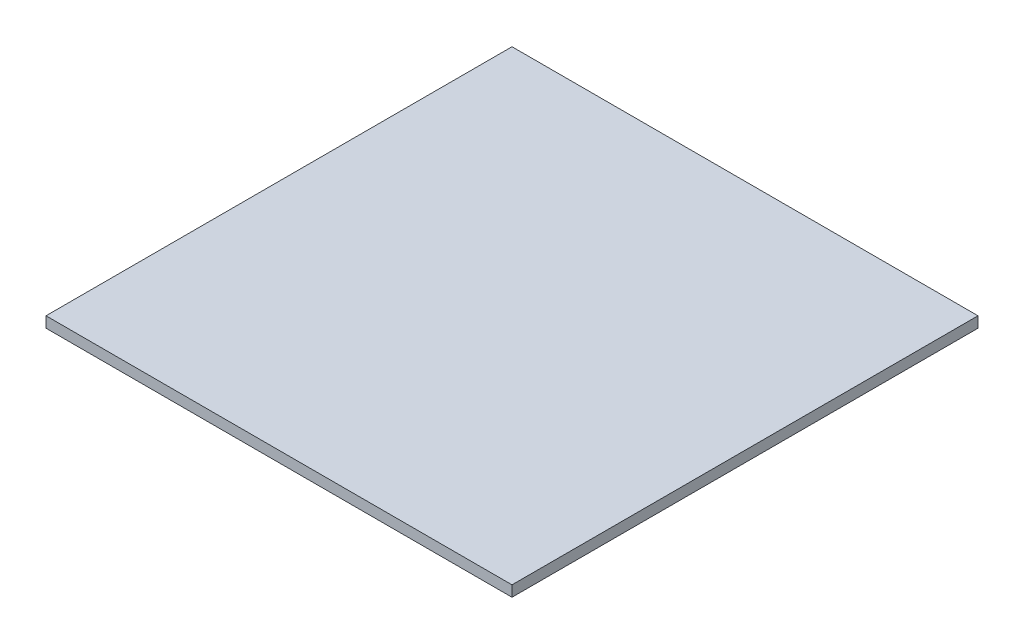
ISO-10303-21;
HEADER;
FILE_DESCRIPTION(('STEP AP214'),'2;1');
FILE_NAME('part.step','',(''),(''),'','','');
FILE_SCHEMA(('AUTOMOTIVE_DESIGN { 1 0 10303 214 1 1 1 1 }'));
ENDSEC;
DATA;
#1=APPLICATION_CONTEXT('core data for automotive mechanical design processes');
#2=APPLICATION_PROTOCOL_DEFINITION('international standard','automotive_design',2000,#1);
#3=PRODUCT_CONTEXT('',#1,'mechanical');
#4=PRODUCT('Part','Part','',(#3));
#5=PRODUCT_RELATED_PRODUCT_CATEGORY('part','',(#4));
#6=PRODUCT_DEFINITION_FORMATION('','',#4);
#7=PRODUCT_DEFINITION_CONTEXT('part definition',#1,'design');
#8=PRODUCT_DEFINITION('design','',#6,#7);
#9=PRODUCT_DEFINITION_SHAPE('','',#8);
#10=(LENGTH_UNIT() NAMED_UNIT(*) SI_UNIT(.MILLI.,.METRE.));
#11=(NAMED_UNIT(*) PLANE_ANGLE_UNIT() SI_UNIT($,.RADIAN.));
#12=(NAMED_UNIT(*) SI_UNIT($,.STERADIAN.) SOLID_ANGLE_UNIT());
#13=UNCERTAINTY_MEASURE_WITH_UNIT(LENGTH_MEASURE(1.E-05),#10,'distance_accuracy_value','');
#14=(GEOMETRIC_REPRESENTATION_CONTEXT(3) GLOBAL_UNCERTAINTY_ASSIGNED_CONTEXT((#13)) GLOBAL_UNIT_ASSIGNED_CONTEXT((#10,
#11,#12)) REPRESENTATION_CONTEXT('',''));
#15=CARTESIAN_POINT('',(0.,0.,0.));
#16=DIRECTION('',(0.,0.,1.));
#17=DIRECTION('',(1.,0.,0.));
#18=AXIS2_PLACEMENT_3D('',#15,#16,#17);
#19=CARTESIAN_POINT('',(-99.0564687464461,5.588,-160.876856185318));
#20=DIRECTION('',(1.,0.,0.));
#21=DIRECTION('',(0.,0.,-1.));
#22=AXIS2_PLACEMENT_3D('',#19,#20,#21);
#23=PLANE('',#22);
#24=DIRECTION('',(0.,0.,1.));
#25=VECTOR('',#24,1.);
#26=CARTESIAN_POINT('',(-99.0564687464461,0.,-160.876856185318));
#27=LINE('',#26,#25);
#28=CARTESIAN_POINT('',(-99.0564687464461,0.,-160.876856185318));
#29=VERTEX_POINT('',#28);
#30=CARTESIAN_POINT('',(-99.056468746446,0.,80.4231438146821));
#31=VERTEX_POINT('',#30);
#32=EDGE_CURVE('E95',#29,#31,#27,.T.);
#33=ORIENTED_EDGE('',*,*,#32,.T.);
#34=DIRECTION('',(0.,-1.,0.));
#35=VECTOR('',#34,1.);
#36=CARTESIAN_POINT('',(-99.056468746446,5.588,80.4231438146821));
#37=LINE('',#36,#35);
#38=CARTESIAN_POINT('',(-99.056468746446,5.588,80.4231438146821));
#39=VERTEX_POINT('',#38);
#40=EDGE_CURVE('E11',#39,#31,#37,.T.);
#41=ORIENTED_EDGE('',*,*,#40,.F.);
#42=DIRECTION('',(0.,0.,1.));
#43=VECTOR('',#42,1.);
#44=CARTESIAN_POINT('',(-99.0564687464461,5.588,-160.876856185318));
#45=LINE('',#44,#43);
#46=CARTESIAN_POINT('',(-99.0564687464461,5.588,-160.876856185318));
#47=VERTEX_POINT('',#46);
#48=EDGE_CURVE('E83',#47,#39,#45,.T.);
#49=ORIENTED_EDGE('',*,*,#48,.F.);
#50=DIRECTION('',(0.,-1.,0.));
#51=VECTOR('',#50,1.);
#52=CARTESIAN_POINT('',(-99.0564687464461,5.588,-160.876856185318));
#53=LINE('',#52,#51);
#54=EDGE_CURVE('E91',#47,#29,#53,.T.);
#55=ORIENTED_EDGE('',*,*,#54,.T.);
#56=EDGE_LOOP('',(#33,#41,#49,#55));
#57=FACE_BOUND('',#56,.T.);
#58=ADVANCED_FACE('F32',(#57),#23,.F.);
#59=CARTESIAN_POINT('',(-99.056468746446,5.588,80.4231438146821));
#60=DIRECTION('',(0.,0.,-1.));
#61=DIRECTION('',(-1.,0.,0.));
#62=AXIS2_PLACEMENT_3D('',#59,#60,#61);
#63=PLANE('',#62);
#64=DIRECTION('',(1.,0.,0.));
#65=VECTOR('',#64,1.);
#66=CARTESIAN_POINT('',(-99.056468746446,0.,80.4231438146821));
#67=LINE('',#66,#65);
#68=CARTESIAN_POINT('',(142.243531253554,0.,80.4231438146821));
#69=VERTEX_POINT('',#68);
#70=EDGE_CURVE('E87',#31,#69,#67,.T.);
#71=ORIENTED_EDGE('',*,*,#70,.T.);
#72=DIRECTION('',(0.,-1.,0.));
#73=VECTOR('',#72,1.);
#74=CARTESIAN_POINT('',(142.243531253554,5.588,80.4231438146821));
#75=LINE('',#74,#73);
#76=CARTESIAN_POINT('',(142.243531253554,5.588,80.4231438146821));
#77=VERTEX_POINT('',#76);
#78=EDGE_CURVE('E40',#77,#69,#75,.T.);
#79=ORIENTED_EDGE('',*,*,#78,.F.);
#80=DIRECTION('',(1.,0.,0.));
#81=VECTOR('',#80,1.);
#82=CARTESIAN_POINT('',(-99.056468746446,5.588,80.4231438146821));
#83=LINE('',#82,#81);
#84=EDGE_CURVE('E78',#39,#77,#83,.T.);
#85=ORIENTED_EDGE('',*,*,#84,.F.);
#86=ORIENTED_EDGE('',*,*,#40,.T.);
#87=EDGE_LOOP('',(#71,#79,#85,#86));
#88=FACE_BOUND('',#87,.T.);
#89=ADVANCED_FACE('F86',(#88),#63,.F.);
#90=CARTESIAN_POINT('',(142.243531253554,5.588,-160.876856185318));
#91=DIRECTION('',(-1.,0.,0.));
#92=DIRECTION('',(0.,0.,1.));
#93=AXIS2_PLACEMENT_3D('',#90,#91,#92);
#94=PLANE('',#93);
#95=DIRECTION('',(0.,0.,-1.));
#96=VECTOR('',#95,1.);
#97=CARTESIAN_POINT('',(142.243531253554,0.,-160.876856185318));
#98=LINE('',#97,#96);
#99=CARTESIAN_POINT('',(142.243531253554,0.,-160.876856185318));
#100=VERTEX_POINT('',#99);
#101=EDGE_CURVE('E65',#69,#100,#98,.T.);
#102=ORIENTED_EDGE('',*,*,#101,.T.);
#103=DIRECTION('',(0.,-1.,0.));
#104=VECTOR('',#103,1.);
#105=CARTESIAN_POINT('',(142.243531253554,5.588,-160.876856185318));
#106=LINE('',#105,#104);
#107=CARTESIAN_POINT('',(142.243531253554,5.588,-160.876856185318));
#108=VERTEX_POINT('',#107);
#109=EDGE_CURVE('E88',#108,#100,#106,.T.);
#110=ORIENTED_EDGE('',*,*,#109,.F.);
#111=DIRECTION('',(0.,0.,-1.));
#112=VECTOR('',#111,1.);
#113=CARTESIAN_POINT('',(142.243531253554,5.588,-160.876856185318));
#114=LINE('',#113,#112);
#115=EDGE_CURVE('E81',#77,#108,#114,.T.);
#116=ORIENTED_EDGE('',*,*,#115,.F.);
#117=ORIENTED_EDGE('',*,*,#78,.T.);
#118=EDGE_LOOP('',(#102,#110,#116,#117));
#119=FACE_BOUND('',#118,.T.);
#120=ADVANCED_FACE('F89',(#119),#94,.F.);
#121=CARTESIAN_POINT('',(-99.0564687464461,5.588,-160.876856185318));
#122=DIRECTION('',(0.,0.,1.));
#123=DIRECTION('',(1.,0.,0.));
#124=AXIS2_PLACEMENT_3D('',#121,#122,#123);
#125=PLANE('',#124);
#126=DIRECTION('',(-1.,0.,0.));
#127=VECTOR('',#126,1.);
#128=CARTESIAN_POINT('',(-99.0564687464461,0.,-160.876856185318));
#129=LINE('',#128,#127);
#130=EDGE_CURVE('E71',#100,#29,#129,.T.);
#131=ORIENTED_EDGE('',*,*,#130,.T.);
#132=ORIENTED_EDGE('',*,*,#54,.F.);
#133=DIRECTION('',(-1.,0.,0.));
#134=VECTOR('',#133,1.);
#135=CARTESIAN_POINT('',(-99.0564687464461,5.588,-160.876856185318));
#136=LINE('',#135,#134);
#137=EDGE_CURVE('E48',#108,#47,#136,.T.);
#138=ORIENTED_EDGE('',*,*,#137,.F.);
#139=ORIENTED_EDGE('',*,*,#109,.T.);
#140=EDGE_LOOP('',(#131,#132,#138,#139));
#141=FACE_BOUND('',#140,.T.);
#142=ADVANCED_FACE('F102',(#141),#125,.F.);
#143=CARTESIAN_POINT('',(0.,5.588,0.));
#144=DIRECTION('',(0.,1.,0.));
#145=DIRECTION('',(0.,0.,1.));
#146=AXIS2_PLACEMENT_3D('',#143,#144,#145);
#147=PLANE('',#146);
#148=ORIENTED_EDGE('',*,*,#48,.T.);
#149=ORIENTED_EDGE('',*,*,#84,.T.);
#150=ORIENTED_EDGE('',*,*,#115,.T.);
#151=ORIENTED_EDGE('',*,*,#137,.T.);
#152=EDGE_LOOP('',(#148,#149,#150,#151));
#153=FACE_BOUND('',#152,.T.);
#154=ADVANCED_FACE('F79',(#153),#147,.T.);
#155=CARTESIAN_POINT('',(0.,0.,0.));
#156=DIRECTION('',(0.,1.,0.));
#157=DIRECTION('',(0.,0.,1.));
#158=AXIS2_PLACEMENT_3D('',#155,#156,#157);
#159=PLANE('',#158);
#160=ORIENTED_EDGE('',*,*,#32,.F.);
#161=ORIENTED_EDGE('',*,*,#130,.F.);
#162=ORIENTED_EDGE('',*,*,#101,.F.);
#163=ORIENTED_EDGE('',*,*,#70,.F.);
#164=EDGE_LOOP('',(#160,#161,#162,#163));
#165=FACE_BOUND('',#164,.T.);
#166=ADVANCED_FACE('F105',(#165),#159,.F.);
#167=CLOSED_SHELL('',(#58,#89,#120,#142,#154,#166));
#168=MANIFOLD_SOLID_BREP('B2',#167);
#169=ADVANCED_BREP_SHAPE_REPRESENTATION('',(#18,#168),#14);
#170=SHAPE_DEFINITION_REPRESENTATION(#9,#169);
ENDSEC;
END-ISO-10303-21;
